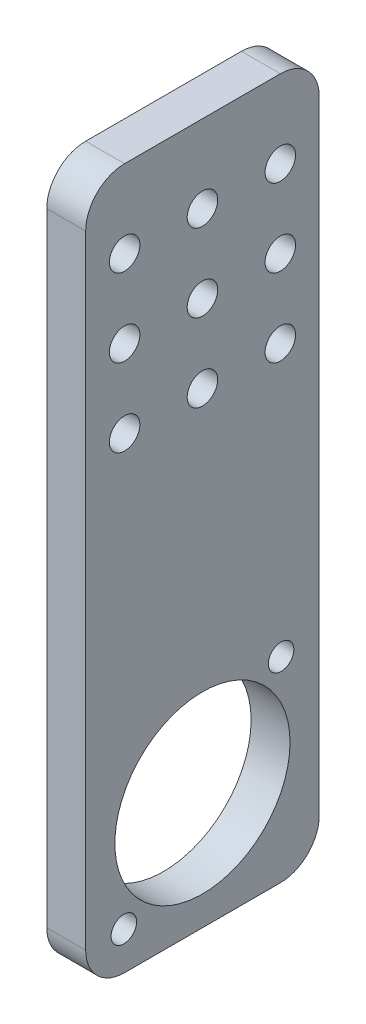
ISO-10303-21;
HEADER;
FILE_DESCRIPTION(('STEP AP214'),'2;1');
FILE_NAME('part.step','',(''),(''),'','','');
FILE_SCHEMA(('AUTOMOTIVE_DESIGN { 1 0 10303 214 1 1 1 1 }'));
ENDSEC;
DATA;
#1=APPLICATION_CONTEXT('core data for automotive mechanical design processes');
#2=APPLICATION_PROTOCOL_DEFINITION('international standard','automotive_design',2000,#1);
#3=PRODUCT_CONTEXT('',#1,'mechanical');
#4=PRODUCT('Part','Part','',(#3));
#5=PRODUCT_RELATED_PRODUCT_CATEGORY('part','',(#4));
#6=PRODUCT_DEFINITION_FORMATION('','',#4);
#7=PRODUCT_DEFINITION_CONTEXT('part definition',#1,'design');
#8=PRODUCT_DEFINITION('design','',#6,#7);
#9=PRODUCT_DEFINITION_SHAPE('','',#8);
#10=(LENGTH_UNIT() NAMED_UNIT(*) SI_UNIT(.MILLI.,.METRE.));
#11=(NAMED_UNIT(*) PLANE_ANGLE_UNIT() SI_UNIT($,.RADIAN.));
#12=(NAMED_UNIT(*) SI_UNIT($,.STERADIAN.) SOLID_ANGLE_UNIT());
#13=UNCERTAINTY_MEASURE_WITH_UNIT(LENGTH_MEASURE(1.E-05),#10,'distance_accuracy_value','');
#14=(GEOMETRIC_REPRESENTATION_CONTEXT(3) GLOBAL_UNCERTAINTY_ASSIGNED_CONTEXT((#13)) GLOBAL_UNIT_ASSIGNED_CONTEXT((#10,
#11,#12)) REPRESENTATION_CONTEXT('',''));
#15=CARTESIAN_POINT('',(0.,0.,0.));
#16=DIRECTION('',(0.,0.,1.));
#17=DIRECTION('',(1.,0.,0.));
#18=AXIS2_PLACEMENT_3D('',#15,#16,#17);
#19=CARTESIAN_POINT('',(95.25,-57.15,184.15));
#20=DIRECTION('',(0.,0.,-1.));
#21=DIRECTION('',(-1.,0.,0.));
#22=AXIS2_PLACEMENT_3D('',#19,#20,#21);
#23=PLANE('',#22);
#24=DIRECTION('',(0.,-1.,0.));
#25=VECTOR('',#24,1.);
#26=CARTESIAN_POINT('',(88.9,-57.15,184.15));
#27=LINE('',#26,#25);
#28=CARTESIAN_POINT('',(88.9,-6.34999999999983,184.15));
#29=VERTEX_POINT('',#28);
#30=CARTESIAN_POINT('',(88.9,-107.95,184.15));
#31=VERTEX_POINT('',#30);
#32=EDGE_CURVE('E163',#29,#31,#27,.T.);
#33=ORIENTED_EDGE('',*,*,#32,.F.);
#34=DIRECTION('',(-1.,0.,0.));
#35=VECTOR('',#34,1.);
#36=CARTESIAN_POINT('',(95.25,-6.34999999999983,184.15));
#37=LINE('',#36,#35);
#38=CARTESIAN_POINT('',(95.25,-6.34999999999983,184.15));
#39=VERTEX_POINT('',#38);
#40=EDGE_CURVE('E11',#39,#29,#37,.T.);
#41=ORIENTED_EDGE('',*,*,#40,.F.);
#42=DIRECTION('',(0.,-1.,0.));
#43=VECTOR('',#42,1.);
#44=CARTESIAN_POINT('',(95.25,-57.15,184.15));
#45=LINE('',#44,#43);
#46=CARTESIAN_POINT('',(95.25,-107.95,184.15));
#47=VERTEX_POINT('',#46);
#48=EDGE_CURVE('E108',#39,#47,#45,.T.);
#49=ORIENTED_EDGE('',*,*,#48,.T.);
#50=DIRECTION('',(-1.,0.,0.));
#51=VECTOR('',#50,1.);
#52=CARTESIAN_POINT('',(95.25,-107.95,184.15));
#53=LINE('',#52,#51);
#54=EDGE_CURVE('E119',#47,#31,#53,.T.);
#55=ORIENTED_EDGE('',*,*,#54,.T.);
#56=EDGE_LOOP('',(#33,#41,#49,#55));
#57=FACE_BOUND('',#56,.T.);
#58=ADVANCED_FACE('F16',(#57),#23,.T.);
#59=CARTESIAN_POINT('',(95.25,-6.34999999999978,190.5));
#60=DIRECTION('',(-1.,0.,0.));
#61=DIRECTION('',(0.,0.,1.));
#62=AXIS2_PLACEMENT_3D('',#59,#60,#61);
#63=CYLINDRICAL_SURFACE('',#62,6.34999999999983);
#64=CARTESIAN_POINT('',(88.9,-6.34999999999978,190.5));
#65=DIRECTION('',(1.,0.,0.));
#66=DIRECTION('',(0.,0.,-1.));
#67=AXIS2_PLACEMENT_3D('',#64,#65,#66);
#68=CIRCLE('',#67,6.34999999999983);
#69=CARTESIAN_POINT('',(88.9,0.,190.5));
#70=VERTEX_POINT('',#69);
#71=EDGE_CURVE('E113',#29,#70,#68,.T.);
#72=ORIENTED_EDGE('',*,*,#71,.T.);
#73=DIRECTION('',(-1.,0.,0.));
#74=VECTOR('',#73,1.);
#75=CARTESIAN_POINT('',(95.25,0.,190.5));
#76=LINE('',#75,#74);
#77=CARTESIAN_POINT('',(95.25,0.,190.5));
#78=VERTEX_POINT('',#77);
#79=EDGE_CURVE('E26',#78,#70,#76,.T.);
#80=ORIENTED_EDGE('',*,*,#79,.F.);
#81=CARTESIAN_POINT('',(95.25,-6.34999999999978,190.5));
#82=DIRECTION('',(1.,0.,0.));
#83=DIRECTION('',(0.,0.,-1.));
#84=AXIS2_PLACEMENT_3D('',#81,#82,#83);
#85=CIRCLE('',#84,6.34999999999983);
#86=EDGE_CURVE('E101',#39,#78,#85,.T.);
#87=ORIENTED_EDGE('',*,*,#86,.F.);
#88=ORIENTED_EDGE('',*,*,#40,.T.);
#89=EDGE_LOOP('',(#72,#80,#87,#88));
#90=FACE_BOUND('',#89,.T.);
#91=ADVANCED_FACE('F111',(#90),#63,.T.);
#92=CARTESIAN_POINT('',(95.25,0.,139.7));
#93=DIRECTION('',(0.,-1.,0.));
#94=DIRECTION('',(0.,0.,-1.));
#95=AXIS2_PLACEMENT_3D('',#92,#93,#94);
#96=PLANE('',#95);
#97=DIRECTION('',(0.,0.,1.));
#98=VECTOR('',#97,1.);
#99=CARTESIAN_POINT('',(88.9,0.,139.7));
#100=LINE('',#99,#98);
#101=CARTESIAN_POINT('',(88.9,0.,215.9));
#102=VERTEX_POINT('',#101);
#103=EDGE_CURVE('E160',#70,#102,#100,.T.);
#104=ORIENTED_EDGE('',*,*,#103,.T.);
#105=DIRECTION('',(-1.,0.,0.));
#106=VECTOR('',#105,1.);
#107=CARTESIAN_POINT('',(95.25,0.,215.9));
#108=LINE('',#107,#106);
#109=CARTESIAN_POINT('',(95.25,0.,215.9));
#110=VERTEX_POINT('',#109);
#111=EDGE_CURVE('E98',#110,#102,#108,.T.);
#112=ORIENTED_EDGE('',*,*,#111,.F.);
#113=DIRECTION('',(0.,0.,1.));
#114=VECTOR('',#113,1.);
#115=CARTESIAN_POINT('',(95.25,0.,139.7));
#116=LINE('',#115,#114);
#117=EDGE_CURVE('E92',#78,#110,#116,.T.);
#118=ORIENTED_EDGE('',*,*,#117,.F.);
#119=ORIENTED_EDGE('',*,*,#79,.T.);
#120=EDGE_LOOP('',(#104,#112,#118,#119));
#121=FACE_BOUND('',#120,.T.);
#122=ADVANCED_FACE('F95',(#121),#96,.F.);
#123=CARTESIAN_POINT('',(95.25,-6.34999999999987,215.9));
#124=DIRECTION('',(-1.,0.,0.));
#125=DIRECTION('',(0.,0.,1.));
#126=AXIS2_PLACEMENT_3D('',#123,#124,#125);
#127=CYLINDRICAL_SURFACE('',#126,6.35);
#128=CARTESIAN_POINT('',(88.9,-6.34999999999987,215.9));
#129=DIRECTION('',(1.,0.,0.));
#130=DIRECTION('',(0.,0.,-1.));
#131=AXIS2_PLACEMENT_3D('',#128,#129,#130);
#132=CIRCLE('',#131,6.35);
#133=CARTESIAN_POINT('',(88.9,-6.34999999999983,222.25));
#134=VERTEX_POINT('',#133);
#135=EDGE_CURVE('E63',#102,#134,#132,.T.);
#136=ORIENTED_EDGE('',*,*,#135,.T.);
#137=DIRECTION('',(-1.,0.,0.));
#138=VECTOR('',#137,1.);
#139=CARTESIAN_POINT('',(95.25,-6.34999999999983,222.25));
#140=LINE('',#139,#138);
#141=CARTESIAN_POINT('',(95.25,-6.34999999999983,222.25));
#142=VERTEX_POINT('',#141);
#143=EDGE_CURVE('E115',#142,#134,#140,.T.);
#144=ORIENTED_EDGE('',*,*,#143,.F.);
#145=CARTESIAN_POINT('',(95.25,-6.34999999999987,215.9));
#146=DIRECTION('',(1.,0.,0.));
#147=DIRECTION('',(0.,0.,-1.));
#148=AXIS2_PLACEMENT_3D('',#145,#146,#147);
#149=CIRCLE('',#148,6.35);
#150=EDGE_CURVE('E100',#110,#142,#149,.T.);
#151=ORIENTED_EDGE('',*,*,#150,.F.);
#152=ORIENTED_EDGE('',*,*,#111,.T.);
#153=EDGE_LOOP('',(#136,#144,#151,#152));
#154=FACE_BOUND('',#153,.T.);
#155=ADVANCED_FACE('F299',(#154),#127,.T.);
#156=CARTESIAN_POINT('',(95.25,-57.15,222.25));
#157=DIRECTION('',(0.,0.,-1.));
#158=DIRECTION('',(-1.,0.,0.));
#159=AXIS2_PLACEMENT_3D('',#156,#157,#158);
#160=PLANE('',#159);
#161=DIRECTION('',(0.,-1.,0.));
#162=VECTOR('',#161,1.);
#163=CARTESIAN_POINT('',(88.9,-57.15,222.25));
#164=LINE('',#163,#162);
#165=CARTESIAN_POINT('',(88.9,-107.95,222.25));
#166=VERTEX_POINT('',#165);
#167=EDGE_CURVE('E67',#134,#166,#164,.T.);
#168=ORIENTED_EDGE('',*,*,#167,.T.);
#169=DIRECTION('',(-1.,0.,0.));
#170=VECTOR('',#169,1.);
#171=CARTESIAN_POINT('',(95.25,-107.95,222.25));
#172=LINE('',#171,#170);
#173=CARTESIAN_POINT('',(95.25,-107.95,222.25));
#174=VERTEX_POINT('',#173);
#175=EDGE_CURVE('E20',#174,#166,#172,.T.);
#176=ORIENTED_EDGE('',*,*,#175,.F.);
#177=DIRECTION('',(0.,-1.,0.));
#178=VECTOR('',#177,1.);
#179=CARTESIAN_POINT('',(95.25,-57.15,222.25));
#180=LINE('',#179,#178);
#181=EDGE_CURVE('E35',#142,#174,#180,.T.);
#182=ORIENTED_EDGE('',*,*,#181,.F.);
#183=ORIENTED_EDGE('',*,*,#143,.T.);
#184=EDGE_LOOP('',(#168,#176,#182,#183));
#185=FACE_BOUND('',#184,.T.);
#186=ADVANCED_FACE('F297',(#185),#160,.F.);
#187=CARTESIAN_POINT('',(95.25,-107.95,215.9));
#188=DIRECTION('',(-1.,0.,0.));
#189=DIRECTION('',(0.,0.,1.));
#190=AXIS2_PLACEMENT_3D('',#187,#188,#189);
#191=CYLINDRICAL_SURFACE('',#190,6.35000000000008);
#192=CARTESIAN_POINT('',(88.9,-107.95,215.9));
#193=DIRECTION('',(1.,0.,0.));
#194=DIRECTION('',(0.,0.,-1.));
#195=AXIS2_PLACEMENT_3D('',#192,#193,#194);
#196=CIRCLE('',#195,6.35000000000008);
#197=CARTESIAN_POINT('',(88.9,-114.3,215.9));
#198=VERTEX_POINT('',#197);
#199=EDGE_CURVE('E171',#166,#198,#196,.T.);
#200=ORIENTED_EDGE('',*,*,#199,.T.);
#201=DIRECTION('',(-1.,0.,0.));
#202=VECTOR('',#201,1.);
#203=CARTESIAN_POINT('',(95.25,-114.3,215.9));
#204=LINE('',#203,#202);
#205=CARTESIAN_POINT('',(95.25,-114.3,215.9));
#206=VERTEX_POINT('',#205);
#207=EDGE_CURVE('E124',#206,#198,#204,.T.);
#208=ORIENTED_EDGE('',*,*,#207,.F.);
#209=CARTESIAN_POINT('',(95.25,-107.95,215.9));
#210=DIRECTION('',(1.,0.,0.));
#211=DIRECTION('',(0.,0.,-1.));
#212=AXIS2_PLACEMENT_3D('',#209,#210,#211);
#213=CIRCLE('',#212,6.35000000000008);
#214=EDGE_CURVE('E75',#174,#206,#213,.T.);
#215=ORIENTED_EDGE('',*,*,#214,.F.);
#216=ORIENTED_EDGE('',*,*,#175,.T.);
#217=EDGE_LOOP('',(#200,#208,#215,#216));
#218=FACE_BOUND('',#217,.T.);
#219=ADVANCED_FACE('F294',(#218),#191,.T.);
#220=CARTESIAN_POINT('',(95.25,-114.3,203.2));
#221=DIRECTION('',(0.,1.,0.));
#222=DIRECTION('',(0.,0.,1.));
#223=AXIS2_PLACEMENT_3D('',#220,#221,#222);
#224=PLANE('',#223);
#225=DIRECTION('',(0.,0.,-1.));
#226=VECTOR('',#225,1.);
#227=CARTESIAN_POINT('',(88.9,-114.3,203.2));
#228=LINE('',#227,#226);
#229=CARTESIAN_POINT('',(88.9,-114.3,190.5));
#230=VERTEX_POINT('',#229);
#231=EDGE_CURVE('E169',#198,#230,#228,.T.);
#232=ORIENTED_EDGE('',*,*,#231,.T.);
#233=DIRECTION('',(-1.,0.,0.));
#234=VECTOR('',#233,1.);
#235=CARTESIAN_POINT('',(95.25,-114.3,190.5));
#236=LINE('',#235,#234);
#237=CARTESIAN_POINT('',(95.25,-114.3,190.5));
#238=VERTEX_POINT('',#237);
#239=EDGE_CURVE('E121',#238,#230,#236,.T.);
#240=ORIENTED_EDGE('',*,*,#239,.F.);
#241=DIRECTION('',(0.,0.,-1.));
#242=VECTOR('',#241,1.);
#243=CARTESIAN_POINT('',(95.25,-114.3,203.2));
#244=LINE('',#243,#242);
#245=EDGE_CURVE('E213',#206,#238,#244,.T.);
#246=ORIENTED_EDGE('',*,*,#245,.F.);
#247=ORIENTED_EDGE('',*,*,#207,.T.);
#248=EDGE_LOOP('',(#232,#240,#246,#247));
#249=FACE_BOUND('',#248,.T.);
#250=ADVANCED_FACE('F290',(#249),#224,.F.);
#251=CARTESIAN_POINT('',(95.25,-25.4,203.2));
#252=DIRECTION('',(-1.,0.,0.));
#253=DIRECTION('',(0.,0.,1.));
#254=AXIS2_PLACEMENT_3D('',#251,#252,#253);
#255=CYLINDRICAL_SURFACE('',#254,2.4892);
#256=CARTESIAN_POINT('',(95.25,-25.4,203.2));
#257=DIRECTION('',(1.,0.,0.));
#258=DIRECTION('',(0.,0.,-1.));
#259=AXIS2_PLACEMENT_3D('',#256,#257,#258);
#260=CIRCLE('',#259,2.4892);
#261=CARTESIAN_POINT('',(95.25,-25.4,200.7108));
#262=VERTEX_POINT('',#261);
#263=EDGE_CURVE('E185',#262,#262,#260,.T.);
#264=ORIENTED_EDGE('',*,*,#263,.T.);
#265=EDGE_LOOP('',(#264));
#266=FACE_BOUND('',#265,.T.);
#267=CARTESIAN_POINT('',(88.9,-25.4,203.2));
#268=DIRECTION('',(1.,0.,0.));
#269=DIRECTION('',(0.,0.,-1.));
#270=AXIS2_PLACEMENT_3D('',#267,#268,#269);
#271=CIRCLE('',#270,2.4892);
#272=CARTESIAN_POINT('',(88.9,-25.4,200.7108));
#273=VERTEX_POINT('',#272);
#274=EDGE_CURVE('E135',#273,#273,#271,.T.);
#275=ORIENTED_EDGE('',*,*,#274,.F.);
#276=EDGE_LOOP('',(#275));
#277=FACE_BOUND('',#276,.T.);
#278=ADVANCED_FACE('F293',(#266,#277),#255,.F.);
#279=CARTESIAN_POINT('',(95.25,-25.4,215.9));
#280=DIRECTION('',(-1.,0.,0.));
#281=DIRECTION('',(0.,0.,1.));
#282=AXIS2_PLACEMENT_3D('',#279,#280,#281);
#283=CYLINDRICAL_SURFACE('',#282,2.4892);
#284=CARTESIAN_POINT('',(95.25,-25.4,215.9));
#285=DIRECTION('',(1.,0.,0.));
#286=DIRECTION('',(0.,0.,-1.));
#287=AXIS2_PLACEMENT_3D('',#284,#285,#286);
#288=CIRCLE('',#287,2.4892);
#289=CARTESIAN_POINT('',(95.25,-25.4,213.4108));
#290=VERTEX_POINT('',#289);
#291=EDGE_CURVE('E188',#290,#290,#288,.T.);
#292=ORIENTED_EDGE('',*,*,#291,.T.);
#293=EDGE_LOOP('',(#292));
#294=FACE_BOUND('',#293,.T.);
#295=CARTESIAN_POINT('',(88.9,-25.4,215.9));
#296=DIRECTION('',(1.,0.,0.));
#297=DIRECTION('',(0.,0.,-1.));
#298=AXIS2_PLACEMENT_3D('',#295,#296,#297);
#299=CIRCLE('',#298,2.4892);
#300=CARTESIAN_POINT('',(88.9,-25.4,213.4108));
#301=VERTEX_POINT('',#300);
#302=EDGE_CURVE('E138',#301,#301,#299,.T.);
#303=ORIENTED_EDGE('',*,*,#302,.F.);
#304=EDGE_LOOP('',(#303));
#305=FACE_BOUND('',#304,.T.);
#306=ADVANCED_FACE('F402',(#294,#305),#283,.F.);
#307=CARTESIAN_POINT('',(95.25,-38.1,190.5));
#308=DIRECTION('',(-1.,0.,0.));
#309=DIRECTION('',(0.,0.,1.));
#310=AXIS2_PLACEMENT_3D('',#307,#308,#309);
#311=CYLINDRICAL_SURFACE('',#310,2.4892);
#312=CARTESIAN_POINT('',(95.25,-38.1,190.5));
#313=DIRECTION('',(1.,0.,0.));
#314=DIRECTION('',(0.,0.,-1.));
#315=AXIS2_PLACEMENT_3D('',#312,#313,#314);
#316=CIRCLE('',#315,2.4892);
#317=CARTESIAN_POINT('',(95.25,-38.1,188.0108));
#318=VERTEX_POINT('',#317);
#319=EDGE_CURVE('E191',#318,#318,#316,.T.);
#320=ORIENTED_EDGE('',*,*,#319,.T.);
#321=EDGE_LOOP('',(#320));
#322=FACE_BOUND('',#321,.T.);
#323=CARTESIAN_POINT('',(88.9,-38.1,190.5));
#324=DIRECTION('',(1.,0.,0.));
#325=DIRECTION('',(0.,0.,-1.));
#326=AXIS2_PLACEMENT_3D('',#323,#324,#325);
#327=CIRCLE('',#326,2.4892);
#328=CARTESIAN_POINT('',(88.9,-38.1,188.0108));
#329=VERTEX_POINT('',#328);
#330=EDGE_CURVE('E141',#329,#329,#327,.T.);
#331=ORIENTED_EDGE('',*,*,#330,.F.);
#332=EDGE_LOOP('',(#331));
#333=FACE_BOUND('',#332,.T.);
#334=ADVANCED_FACE('F393',(#322,#333),#311,.F.);
#335=CARTESIAN_POINT('',(95.25,-38.1,203.2));
#336=DIRECTION('',(-1.,0.,0.));
#337=DIRECTION('',(0.,0.,1.));
#338=AXIS2_PLACEMENT_3D('',#335,#336,#337);
#339=CYLINDRICAL_SURFACE('',#338,2.4892);
#340=CARTESIAN_POINT('',(95.25,-38.1,203.2));
#341=DIRECTION('',(1.,0.,0.));
#342=DIRECTION('',(0.,0.,-1.));
#343=AXIS2_PLACEMENT_3D('',#340,#341,#342);
#344=CIRCLE('',#343,2.4892);
#345=CARTESIAN_POINT('',(95.25,-38.1,200.7108));
#346=VERTEX_POINT('',#345);
#347=EDGE_CURVE('E194',#346,#346,#344,.T.);
#348=ORIENTED_EDGE('',*,*,#347,.T.);
#349=EDGE_LOOP('',(#348));
#350=FACE_BOUND('',#349,.T.);
#351=CARTESIAN_POINT('',(88.9,-38.1,203.2));
#352=DIRECTION('',(1.,0.,0.));
#353=DIRECTION('',(0.,0.,-1.));
#354=AXIS2_PLACEMENT_3D('',#351,#352,#353);
#355=CIRCLE('',#354,2.4892);
#356=CARTESIAN_POINT('',(88.9,-38.1,200.7108));
#357=VERTEX_POINT('',#356);
#358=EDGE_CURVE('E144',#357,#357,#355,.T.);
#359=ORIENTED_EDGE('',*,*,#358,.F.);
#360=EDGE_LOOP('',(#359));
#361=FACE_BOUND('',#360,.T.);
#362=ADVANCED_FACE('F384',(#350,#361),#339,.F.);
#363=CARTESIAN_POINT('',(95.25,-38.1,215.9));
#364=DIRECTION('',(-1.,0.,0.));
#365=DIRECTION('',(0.,0.,1.));
#366=AXIS2_PLACEMENT_3D('',#363,#364,#365);
#367=CYLINDRICAL_SURFACE('',#366,2.4892);
#368=CARTESIAN_POINT('',(95.25,-38.1,215.9));
#369=DIRECTION('',(1.,0.,0.));
#370=DIRECTION('',(0.,0.,-1.));
#371=AXIS2_PLACEMENT_3D('',#368,#369,#370);
#372=CIRCLE('',#371,2.4892);
#373=CARTESIAN_POINT('',(95.25,-38.1,213.4108));
#374=VERTEX_POINT('',#373);
#375=EDGE_CURVE('E197',#374,#374,#372,.T.);
#376=ORIENTED_EDGE('',*,*,#375,.T.);
#377=EDGE_LOOP('',(#376));
#378=FACE_BOUND('',#377,.T.);
#379=CARTESIAN_POINT('',(88.9,-38.1,215.9));
#380=DIRECTION('',(1.,0.,0.));
#381=DIRECTION('',(0.,0.,-1.));
#382=AXIS2_PLACEMENT_3D('',#379,#380,#381);
#383=CIRCLE('',#382,2.4892);
#384=CARTESIAN_POINT('',(88.9,-38.1,213.4108));
#385=VERTEX_POINT('',#384);
#386=EDGE_CURVE('E147',#385,#385,#383,.T.);
#387=ORIENTED_EDGE('',*,*,#386,.F.);
#388=EDGE_LOOP('',(#387));
#389=FACE_BOUND('',#388,.T.);
#390=ADVANCED_FACE('F375',(#378,#389),#367,.F.);
#391=CARTESIAN_POINT('',(95.25,-12.7,190.5));
#392=DIRECTION('',(-1.,0.,0.));
#393=DIRECTION('',(0.,0.,1.));
#394=AXIS2_PLACEMENT_3D('',#391,#392,#393);
#395=CYLINDRICAL_SURFACE('',#394,2.4892);
#396=CARTESIAN_POINT('',(95.25,-12.7,190.5));
#397=DIRECTION('',(1.,0.,0.));
#398=DIRECTION('',(0.,0.,-1.));
#399=AXIS2_PLACEMENT_3D('',#396,#397,#398);
#400=CIRCLE('',#399,2.4892);
#401=CARTESIAN_POINT('',(95.25,-12.7,188.0108));
#402=VERTEX_POINT('',#401);
#403=EDGE_CURVE('E200',#402,#402,#400,.T.);
#404=ORIENTED_EDGE('',*,*,#403,.T.);
#405=EDGE_LOOP('',(#404));
#406=FACE_BOUND('',#405,.T.);
#407=CARTESIAN_POINT('',(88.9,-12.7,190.5));
#408=DIRECTION('',(1.,0.,0.));
#409=DIRECTION('',(0.,0.,-1.));
#410=AXIS2_PLACEMENT_3D('',#407,#408,#409);
#411=CIRCLE('',#410,2.4892);
#412=CARTESIAN_POINT('',(88.9,-12.7,188.0108));
#413=VERTEX_POINT('',#412);
#414=EDGE_CURVE('E150',#413,#413,#411,.T.);
#415=ORIENTED_EDGE('',*,*,#414,.F.);
#416=EDGE_LOOP('',(#415));
#417=FACE_BOUND('',#416,.T.);
#418=ADVANCED_FACE('F366',(#406,#417),#395,.F.);
#419=CARTESIAN_POINT('',(95.25,-12.7,203.2));
#420=DIRECTION('',(-1.,0.,0.));
#421=DIRECTION('',(0.,0.,1.));
#422=AXIS2_PLACEMENT_3D('',#419,#420,#421);
#423=CYLINDRICAL_SURFACE('',#422,2.4892);
#424=CARTESIAN_POINT('',(95.25,-12.7,203.2));
#425=DIRECTION('',(1.,0.,0.));
#426=DIRECTION('',(0.,0.,-1.));
#427=AXIS2_PLACEMENT_3D('',#424,#425,#426);
#428=CIRCLE('',#427,2.4892);
#429=CARTESIAN_POINT('',(95.25,-12.7,200.7108));
#430=VERTEX_POINT('',#429);
#431=EDGE_CURVE('E203',#430,#430,#428,.T.);
#432=ORIENTED_EDGE('',*,*,#431,.T.);
#433=EDGE_LOOP('',(#432));
#434=FACE_BOUND('',#433,.T.);
#435=CARTESIAN_POINT('',(88.9,-12.7,203.2));
#436=DIRECTION('',(1.,0.,0.));
#437=DIRECTION('',(0.,0.,-1.));
#438=AXIS2_PLACEMENT_3D('',#435,#436,#437);
#439=CIRCLE('',#438,2.4892);
#440=CARTESIAN_POINT('',(88.9,-12.7,200.7108));
#441=VERTEX_POINT('',#440);
#442=EDGE_CURVE('E153',#441,#441,#439,.T.);
#443=ORIENTED_EDGE('',*,*,#442,.F.);
#444=EDGE_LOOP('',(#443));
#445=FACE_BOUND('',#444,.T.);
#446=ADVANCED_FACE('F357',(#434,#445),#423,.F.);
#447=CARTESIAN_POINT('',(95.25,-12.7,215.9));
#448=DIRECTION('',(-1.,0.,0.));
#449=DIRECTION('',(0.,0.,1.));
#450=AXIS2_PLACEMENT_3D('',#447,#448,#449);
#451=CYLINDRICAL_SURFACE('',#450,2.4892);
#452=CARTESIAN_POINT('',(95.25,-12.7,215.9));
#453=DIRECTION('',(1.,0.,0.));
#454=DIRECTION('',(0.,0.,-1.));
#455=AXIS2_PLACEMENT_3D('',#452,#453,#454);
#456=CIRCLE('',#455,2.4892);
#457=CARTESIAN_POINT('',(95.25,-12.7,213.4108));
#458=VERTEX_POINT('',#457);
#459=EDGE_CURVE('E206',#458,#458,#456,.T.);
#460=ORIENTED_EDGE('',*,*,#459,.T.);
#461=EDGE_LOOP('',(#460));
#462=FACE_BOUND('',#461,.T.);
#463=CARTESIAN_POINT('',(88.9,-12.7,215.9));
#464=DIRECTION('',(1.,0.,0.));
#465=DIRECTION('',(0.,0.,-1.));
#466=AXIS2_PLACEMENT_3D('',#463,#464,#465);
#467=CIRCLE('',#466,2.4892);
#468=CARTESIAN_POINT('',(88.9,-12.7,213.4108));
#469=VERTEX_POINT('',#468);
#470=EDGE_CURVE('E156',#469,#469,#467,.T.);
#471=ORIENTED_EDGE('',*,*,#470,.F.);
#472=EDGE_LOOP('',(#471));
#473=FACE_BOUND('',#472,.T.);
#474=ADVANCED_FACE('F288',(#462,#473),#451,.F.);
#475=CARTESIAN_POINT('',(95.25,-107.95,190.5));
#476=DIRECTION('',(-1.,0.,0.));
#477=DIRECTION('',(0.,0.,1.));
#478=AXIS2_PLACEMENT_3D('',#475,#476,#477);
#479=CYLINDRICAL_SURFACE('',#478,6.35);
#480=CARTESIAN_POINT('',(88.9,-107.95,190.5));
#481=DIRECTION('',(1.,0.,0.));
#482=DIRECTION('',(0.,0.,-1.));
#483=AXIS2_PLACEMENT_3D('',#480,#481,#482);
#484=CIRCLE('',#483,6.35);
#485=EDGE_CURVE('E166',#230,#31,#484,.T.);
#486=ORIENTED_EDGE('',*,*,#485,.T.);
#487=ORIENTED_EDGE('',*,*,#54,.F.);
#488=CARTESIAN_POINT('',(95.25,-107.95,190.5));
#489=DIRECTION('',(1.,0.,0.));
#490=DIRECTION('',(0.,0.,-1.));
#491=AXIS2_PLACEMENT_3D('',#488,#489,#490);
#492=CIRCLE('',#491,6.35);
#493=EDGE_CURVE('E211',#238,#47,#492,.T.);
#494=ORIENTED_EDGE('',*,*,#493,.F.);
#495=ORIENTED_EDGE('',*,*,#239,.T.);
#496=EDGE_LOOP('',(#486,#487,#494,#495));
#497=FACE_BOUND('',#496,.T.);
#498=ADVANCED_FACE('F242',(#497),#479,.T.);
#499=CARTESIAN_POINT('',(95.25,-95.25,203.2));
#500=DIRECTION('',(-1.,0.,0.));
#501=DIRECTION('',(0.,0.,1.));
#502=AXIS2_PLACEMENT_3D('',#499,#500,#501);
#503=CYLINDRICAL_SURFACE('',#502,14.2875);
#504=CARTESIAN_POINT('',(95.25,-95.25,203.2));
#505=DIRECTION('',(1.,0.,0.));
#506=DIRECTION('',(0.,0.,-1.));
#507=AXIS2_PLACEMENT_3D('',#504,#505,#506);
#508=CIRCLE('',#507,14.2875);
#509=CARTESIAN_POINT('',(95.25,-95.25,188.9125));
#510=VERTEX_POINT('',#509);
#511=EDGE_CURVE('E218',#510,#510,#508,.T.);
#512=ORIENTED_EDGE('',*,*,#511,.T.);
#513=EDGE_LOOP('',(#512));
#514=FACE_BOUND('',#513,.T.);
#515=CARTESIAN_POINT('',(88.9,-95.25,203.2));
#516=DIRECTION('',(1.,0.,0.));
#517=DIRECTION('',(0.,0.,-1.));
#518=AXIS2_PLACEMENT_3D('',#515,#516,#517);
#519=CIRCLE('',#518,14.2875);
#520=CARTESIAN_POINT('',(88.9,-95.25,188.9125));
#521=VERTEX_POINT('',#520);
#522=EDGE_CURVE('E174',#521,#521,#519,.T.);
#523=ORIENTED_EDGE('',*,*,#522,.F.);
#524=EDGE_LOOP('',(#523));
#525=FACE_BOUND('',#524,.T.);
#526=ADVANCED_FACE('F238',(#514,#525),#503,.F.);
#527=CARTESIAN_POINT('',(95.25,-108.073805740887,216.023805740887));
#528=DIRECTION('',(-1.,0.,0.));
#529=DIRECTION('',(0.,0.,1.));
#530=AXIS2_PLACEMENT_3D('',#527,#528,#529);
#531=CYLINDRICAL_SURFACE('',#530,2.0828);
#532=CARTESIAN_POINT('',(95.25,-108.073805740887,216.023805740887));
#533=DIRECTION('',(1.,0.,0.));
#534=DIRECTION('',(0.,0.,-1.));
#535=AXIS2_PLACEMENT_3D('',#532,#533,#534);
#536=CIRCLE('',#535,2.0828);
#537=CARTESIAN_POINT('',(95.25,-108.073805740887,213.941005740887));
#538=VERTEX_POINT('',#537);
#539=EDGE_CURVE('E221',#538,#538,#536,.T.);
#540=ORIENTED_EDGE('',*,*,#539,.T.);
#541=EDGE_LOOP('',(#540));
#542=FACE_BOUND('',#541,.T.);
#543=CARTESIAN_POINT('',(88.9,-108.073805740887,216.023805740887));
#544=DIRECTION('',(1.,0.,0.));
#545=DIRECTION('',(0.,0.,-1.));
#546=AXIS2_PLACEMENT_3D('',#543,#544,#545);
#547=CIRCLE('',#546,2.0828);
#548=CARTESIAN_POINT('',(88.9,-108.073805740887,213.941005740887));
#549=VERTEX_POINT('',#548);
#550=EDGE_CURVE('E177',#549,#549,#547,.T.);
#551=ORIENTED_EDGE('',*,*,#550,.F.);
#552=EDGE_LOOP('',(#551));
#553=FACE_BOUND('',#552,.T.);
#554=ADVANCED_FACE('F241',(#542,#553),#531,.F.);
#555=CARTESIAN_POINT('',(95.25,-82.4261942591132,190.376194259113));
#556=DIRECTION('',(-1.,0.,0.));
#557=DIRECTION('',(0.,0.,1.));
#558=AXIS2_PLACEMENT_3D('',#555,#556,#557);
#559=CYLINDRICAL_SURFACE('',#558,2.0828);
#560=CARTESIAN_POINT('',(95.25,-82.4261942591132,190.376194259113));
#561=DIRECTION('',(1.,0.,0.));
#562=DIRECTION('',(0.,0.,-1.));
#563=AXIS2_PLACEMENT_3D('',#560,#561,#562);
#564=CIRCLE('',#563,2.0828);
#565=CARTESIAN_POINT('',(95.25,-82.4261942591132,188.293394259113));
#566=VERTEX_POINT('',#565);
#567=EDGE_CURVE('E134',#566,#566,#564,.T.);
#568=ORIENTED_EDGE('',*,*,#567,.T.);
#569=EDGE_LOOP('',(#568));
#570=FACE_BOUND('',#569,.T.);
#571=CARTESIAN_POINT('',(88.9,-82.4261942591132,190.376194259113));
#572=DIRECTION('',(1.,0.,0.));
#573=DIRECTION('',(0.,0.,-1.));
#574=AXIS2_PLACEMENT_3D('',#571,#572,#573);
#575=CIRCLE('',#574,2.0828);
#576=CARTESIAN_POINT('',(88.9,-82.4261942591132,188.293394259113));
#577=VERTEX_POINT('',#576);
#578=EDGE_CURVE('E180',#577,#577,#575,.T.);
#579=ORIENTED_EDGE('',*,*,#578,.F.);
#580=EDGE_LOOP('',(#579));
#581=FACE_BOUND('',#580,.T.);
#582=ADVANCED_FACE('F18',(#570,#581),#559,.F.);
#583=CARTESIAN_POINT('',(95.25,-25.4,190.5));
#584=DIRECTION('',(-1.,0.,0.));
#585=DIRECTION('',(0.,0.,1.));
#586=AXIS2_PLACEMENT_3D('',#583,#584,#585);
#587=CYLINDRICAL_SURFACE('',#586,2.4892);
#588=CARTESIAN_POINT('',(95.25,-25.4,190.5));
#589=DIRECTION('',(1.,0.,0.));
#590=DIRECTION('',(0.,0.,-1.));
#591=AXIS2_PLACEMENT_3D('',#588,#589,#590);
#592=CIRCLE('',#591,2.4892);
#593=CARTESIAN_POINT('',(95.25,-25.4,188.0108));
#594=VERTEX_POINT('',#593);
#595=EDGE_CURVE('E122',#594,#594,#592,.T.);
#596=ORIENTED_EDGE('',*,*,#595,.T.);
#597=EDGE_LOOP('',(#596));
#598=FACE_BOUND('',#597,.T.);
#599=CARTESIAN_POINT('',(88.9,-25.4,190.5));
#600=DIRECTION('',(1.,0.,0.));
#601=DIRECTION('',(0.,0.,-1.));
#602=AXIS2_PLACEMENT_3D('',#599,#600,#601);
#603=CIRCLE('',#602,2.4892);
#604=CARTESIAN_POINT('',(88.9,-25.4,188.0108));
#605=VERTEX_POINT('',#604);
#606=EDGE_CURVE('E131',#605,#605,#603,.T.);
#607=ORIENTED_EDGE('',*,*,#606,.F.);
#608=EDGE_LOOP('',(#607));
#609=FACE_BOUND('',#608,.T.);
#610=ADVANCED_FACE('F232',(#598,#609),#587,.F.);
#611=CARTESIAN_POINT('',(95.25,-57.15,139.7));
#612=DIRECTION('',(1.,0.,0.));
#613=DIRECTION('',(0.,1.,0.));
#614=AXIS2_PLACEMENT_3D('',#611,#612,#613);
#615=PLANE('',#614);
#616=ORIENTED_EDGE('',*,*,#567,.F.);
#617=EDGE_LOOP('',(#616));
#618=FACE_BOUND('',#617,.T.);
#619=ORIENTED_EDGE('',*,*,#539,.F.);
#620=EDGE_LOOP('',(#619));
#621=FACE_BOUND('',#620,.T.);
#622=ORIENTED_EDGE('',*,*,#511,.F.);
#623=EDGE_LOOP('',(#622));
#624=FACE_BOUND('',#623,.T.);
#625=ORIENTED_EDGE('',*,*,#48,.F.);
#626=ORIENTED_EDGE('',*,*,#86,.T.);
#627=ORIENTED_EDGE('',*,*,#117,.T.);
#628=ORIENTED_EDGE('',*,*,#150,.T.);
#629=ORIENTED_EDGE('',*,*,#181,.T.);
#630=ORIENTED_EDGE('',*,*,#214,.T.);
#631=ORIENTED_EDGE('',*,*,#245,.T.);
#632=ORIENTED_EDGE('',*,*,#493,.T.);
#633=EDGE_LOOP('',(#625,#626,#627,#628,#629,#630,#631,#632));
#634=FACE_BOUND('',#633,.T.);
#635=ORIENTED_EDGE('',*,*,#459,.F.);
#636=EDGE_LOOP('',(#635));
#637=FACE_BOUND('',#636,.T.);
#638=ORIENTED_EDGE('',*,*,#431,.F.);
#639=EDGE_LOOP('',(#638));
#640=FACE_BOUND('',#639,.T.);
#641=ORIENTED_EDGE('',*,*,#403,.F.);
#642=EDGE_LOOP('',(#641));
#643=FACE_BOUND('',#642,.T.);
#644=ORIENTED_EDGE('',*,*,#375,.F.);
#645=EDGE_LOOP('',(#644));
#646=FACE_BOUND('',#645,.T.);
#647=ORIENTED_EDGE('',*,*,#347,.F.);
#648=EDGE_LOOP('',(#647));
#649=FACE_BOUND('',#648,.T.);
#650=ORIENTED_EDGE('',*,*,#319,.F.);
#651=EDGE_LOOP('',(#650));
#652=FACE_BOUND('',#651,.T.);
#653=ORIENTED_EDGE('',*,*,#291,.F.);
#654=EDGE_LOOP('',(#653));
#655=FACE_BOUND('',#654,.T.);
#656=ORIENTED_EDGE('',*,*,#263,.F.);
#657=EDGE_LOOP('',(#656));
#658=FACE_BOUND('',#657,.T.);
#659=ORIENTED_EDGE('',*,*,#595,.F.);
#660=EDGE_LOOP('',(#659));
#661=FACE_BOUND('',#660,.T.);
#662=ADVANCED_FACE('F105',(#618,#621,#624,#634,#637,#640,#643,#646,#649,#652,#655,#658,#661),
#615,.T.);
#663=CARTESIAN_POINT('',(88.9,-57.15,139.7));
#664=DIRECTION('',(1.,0.,0.));
#665=DIRECTION('',(0.,1.,0.));
#666=AXIS2_PLACEMENT_3D('',#663,#664,#665);
#667=PLANE('',#666);
#668=ORIENTED_EDGE('',*,*,#578,.T.);
#669=EDGE_LOOP('',(#668));
#670=FACE_BOUND('',#669,.T.);
#671=ORIENTED_EDGE('',*,*,#550,.T.);
#672=EDGE_LOOP('',(#671));
#673=FACE_BOUND('',#672,.T.);
#674=ORIENTED_EDGE('',*,*,#522,.T.);
#675=EDGE_LOOP('',(#674));
#676=FACE_BOUND('',#675,.T.);
#677=ORIENTED_EDGE('',*,*,#32,.T.);
#678=ORIENTED_EDGE('',*,*,#485,.F.);
#679=ORIENTED_EDGE('',*,*,#231,.F.);
#680=ORIENTED_EDGE('',*,*,#199,.F.);
#681=ORIENTED_EDGE('',*,*,#167,.F.);
#682=ORIENTED_EDGE('',*,*,#135,.F.);
#683=ORIENTED_EDGE('',*,*,#103,.F.);
#684=ORIENTED_EDGE('',*,*,#71,.F.);
#685=EDGE_LOOP('',(#677,#678,#679,#680,#681,#682,#683,#684));
#686=FACE_BOUND('',#685,.T.);
#687=ORIENTED_EDGE('',*,*,#470,.T.);
#688=EDGE_LOOP('',(#687));
#689=FACE_BOUND('',#688,.T.);
#690=ORIENTED_EDGE('',*,*,#442,.T.);
#691=EDGE_LOOP('',(#690));
#692=FACE_BOUND('',#691,.T.);
#693=ORIENTED_EDGE('',*,*,#414,.T.);
#694=EDGE_LOOP('',(#693));
#695=FACE_BOUND('',#694,.T.);
#696=ORIENTED_EDGE('',*,*,#386,.T.);
#697=EDGE_LOOP('',(#696));
#698=FACE_BOUND('',#697,.T.);
#699=ORIENTED_EDGE('',*,*,#358,.T.);
#700=EDGE_LOOP('',(#699));
#701=FACE_BOUND('',#700,.T.);
#702=ORIENTED_EDGE('',*,*,#330,.T.);
#703=EDGE_LOOP('',(#702));
#704=FACE_BOUND('',#703,.T.);
#705=ORIENTED_EDGE('',*,*,#302,.T.);
#706=EDGE_LOOP('',(#705));
#707=FACE_BOUND('',#706,.T.);
#708=ORIENTED_EDGE('',*,*,#274,.T.);
#709=EDGE_LOOP('',(#708));
#710=FACE_BOUND('',#709,.T.);
#711=ORIENTED_EDGE('',*,*,#606,.T.);
#712=EDGE_LOOP('',(#711));
#713=FACE_BOUND('',#712,.T.);
#714=ADVANCED_FACE('F231',(#670,#673,#676,#686,#689,#692,#695,#698,#701,#704,#707,#710,#713),
#667,.F.);
#715=CLOSED_SHELL('',(#58,#91,#122,#155,#186,#219,#250,#278,#306,#334,#362,#390,#418,#446,#474,
#498,#526,#554,#582,#610,#662,#714));
#716=MANIFOLD_SOLID_BREP('B1',#715);
#717=ADVANCED_BREP_SHAPE_REPRESENTATION('',(#18,#716),#14);
#718=SHAPE_DEFINITION_REPRESENTATION(#9,#717);
ENDSEC;
END-ISO-10303-21;
